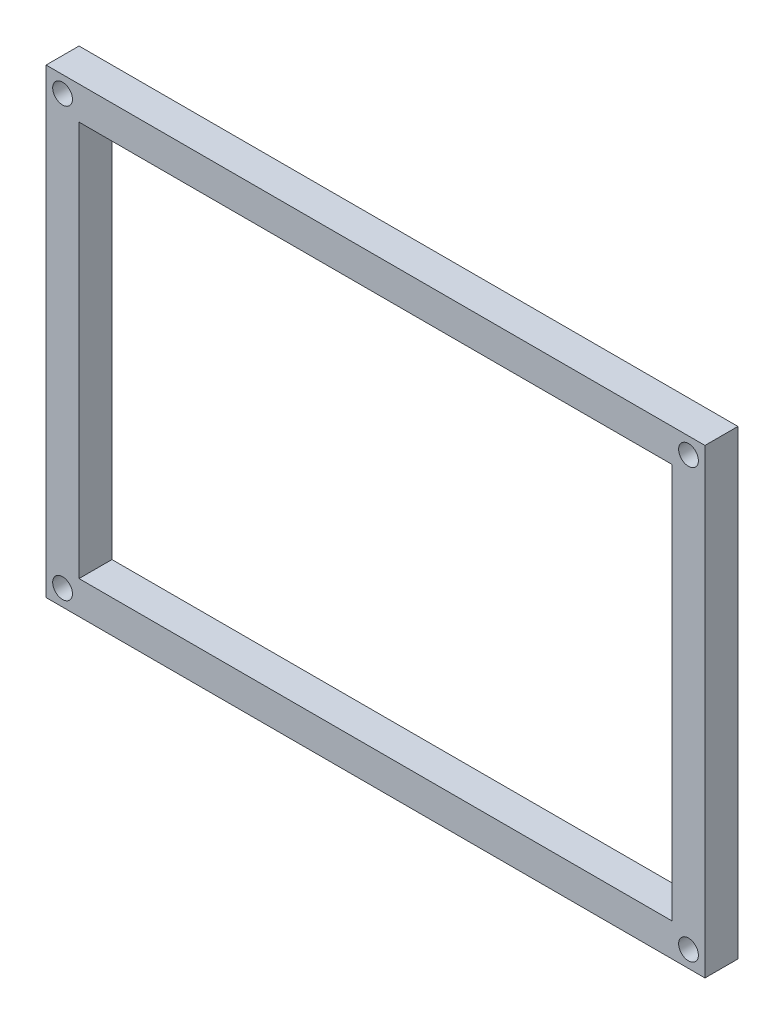
ISO-10303-21;
HEADER;
FILE_DESCRIPTION(('STEP AP214'),'2;1');
FILE_NAME('part.step','',(''),(''),'','','');
FILE_SCHEMA(('AUTOMOTIVE_DESIGN { 1 0 10303 214 1 1 1 1 }'));
ENDSEC;
DATA;
#1=APPLICATION_CONTEXT('core data for automotive mechanical design processes');
#2=APPLICATION_PROTOCOL_DEFINITION('international standard','automotive_design',2000,#1);
#3=PRODUCT_CONTEXT('',#1,'mechanical');
#4=PRODUCT('Part','Part','',(#3));
#5=PRODUCT_RELATED_PRODUCT_CATEGORY('part','',(#4));
#6=PRODUCT_DEFINITION_FORMATION('','',#4);
#7=PRODUCT_DEFINITION_CONTEXT('part definition',#1,'design');
#8=PRODUCT_DEFINITION('design','',#6,#7);
#9=PRODUCT_DEFINITION_SHAPE('','',#8);
#10=(LENGTH_UNIT() NAMED_UNIT(*) SI_UNIT(.MILLI.,.METRE.));
#11=(NAMED_UNIT(*) PLANE_ANGLE_UNIT() SI_UNIT($,.RADIAN.));
#12=(NAMED_UNIT(*) SI_UNIT($,.STERADIAN.) SOLID_ANGLE_UNIT());
#13=UNCERTAINTY_MEASURE_WITH_UNIT(LENGTH_MEASURE(1.E-05),#10,'distance_accuracy_value','');
#14=(GEOMETRIC_REPRESENTATION_CONTEXT(3) GLOBAL_UNCERTAINTY_ASSIGNED_CONTEXT((#13)) GLOBAL_UNIT_ASSIGNED_CONTEXT((#10,
#11,#12)) REPRESENTATION_CONTEXT('',''));
#15=CARTESIAN_POINT('',(0.,0.,0.));
#16=DIRECTION('',(0.,0.,1.));
#17=DIRECTION('',(1.,0.,0.));
#18=AXIS2_PLACEMENT_3D('',#15,#16,#17);
#19=CARTESIAN_POINT('',(0.,-5.,5.));
#20=DIRECTION('',(0.,1.,0.));
#21=DIRECTION('',(-1.,0.,0.));
#22=AXIS2_PLACEMENT_3D('',#19,#20,#21);
#23=PLANE('',#22);
#24=DIRECTION('',(1.,0.,0.));
#25=VECTOR('',#24,1.);
#26=CARTESIAN_POINT('',(0.,-5.,0.));
#27=LINE('',#26,#25);
#28=CARTESIAN_POINT('',(-5.,-5.,0.));
#29=VERTEX_POINT('',#28);
#30=CARTESIAN_POINT('',(95.,-4.99999999999998,0.));
#31=VERTEX_POINT('',#30);
#32=EDGE_CURVE('E153',#29,#31,#27,.T.);
#33=ORIENTED_EDGE('',*,*,#32,.T.);
#34=DIRECTION('',(0.,0.,-1.));
#35=VECTOR('',#34,1.);
#36=CARTESIAN_POINT('',(95.,-4.99999999999998,5.));
#37=LINE('',#36,#35);
#38=CARTESIAN_POINT('',(95.,-4.99999999999998,5.));
#39=VERTEX_POINT('',#38);
#40=EDGE_CURVE('E11',#39,#31,#37,.T.);
#41=ORIENTED_EDGE('',*,*,#40,.F.);
#42=DIRECTION('',(1.,0.,0.));
#43=VECTOR('',#42,1.);
#44=CARTESIAN_POINT('',(0.,-5.,5.));
#45=LINE('',#44,#43);
#46=CARTESIAN_POINT('',(-5.,-5.,5.));
#47=VERTEX_POINT('',#46);
#48=EDGE_CURVE('E112',#47,#39,#45,.T.);
#49=ORIENTED_EDGE('',*,*,#48,.F.);
#50=DIRECTION('',(0.,0.,-1.));
#51=VECTOR('',#50,1.);
#52=CARTESIAN_POINT('',(-5.,-5.,5.));
#53=LINE('',#52,#51);
#54=EDGE_CURVE('E52',#47,#29,#53,.T.);
#55=ORIENTED_EDGE('',*,*,#54,.T.);
#56=EDGE_LOOP('',(#33,#41,#49,#55));
#57=FACE_BOUND('',#56,.T.);
#58=ADVANCED_FACE('F33',(#57),#23,.F.);
#59=CARTESIAN_POINT('',(95.,0.,5.));
#60=DIRECTION('',(-1.,0.,0.));
#61=DIRECTION('',(0.,-1.,0.));
#62=AXIS2_PLACEMENT_3D('',#59,#60,#61);
#63=PLANE('',#62);
#64=DIRECTION('',(0.,1.,0.));
#65=VECTOR('',#64,1.);
#66=CARTESIAN_POINT('',(95.,0.,0.));
#67=LINE('',#66,#65);
#68=CARTESIAN_POINT('',(95.,65.,0.));
#69=VERTEX_POINT('',#68);
#70=EDGE_CURVE('E118',#31,#69,#67,.T.);
#71=ORIENTED_EDGE('',*,*,#70,.T.);
#72=DIRECTION('',(0.,0.,-1.));
#73=VECTOR('',#72,1.);
#74=CARTESIAN_POINT('',(95.,65.,5.));
#75=LINE('',#74,#73);
#76=CARTESIAN_POINT('',(95.,65.,5.));
#77=VERTEX_POINT('',#76);
#78=EDGE_CURVE('E43',#77,#69,#75,.T.);
#79=ORIENTED_EDGE('',*,*,#78,.F.);
#80=DIRECTION('',(0.,1.,0.));
#81=VECTOR('',#80,1.);
#82=CARTESIAN_POINT('',(95.,0.,5.));
#83=LINE('',#82,#81);
#84=EDGE_CURVE('E106',#39,#77,#83,.T.);
#85=ORIENTED_EDGE('',*,*,#84,.F.);
#86=ORIENTED_EDGE('',*,*,#40,.T.);
#87=EDGE_LOOP('',(#71,#79,#85,#86));
#88=FACE_BOUND('',#87,.T.);
#89=ADVANCED_FACE('F117',(#88),#63,.F.);
#90=CARTESIAN_POINT('',(0.,65.,5.));
#91=DIRECTION('',(0.,1.,0.));
#92=DIRECTION('',(-1.,0.,0.));
#93=AXIS2_PLACEMENT_3D('',#90,#91,#92);
#94=PLANE('',#93);
#95=DIRECTION('',(1.,0.,0.));
#96=VECTOR('',#95,1.);
#97=CARTESIAN_POINT('',(0.,65.,0.));
#98=LINE('',#97,#96);
#99=CARTESIAN_POINT('',(-5.,65.,0.));
#100=VERTEX_POINT('',#99);
#101=EDGE_CURVE('E156',#100,#69,#98,.T.);
#102=ORIENTED_EDGE('',*,*,#101,.F.);
#103=DIRECTION('',(0.,0.,-1.));
#104=VECTOR('',#103,1.);
#105=CARTESIAN_POINT('',(-5.,65.,5.));
#106=LINE('',#105,#104);
#107=CARTESIAN_POINT('',(-5.,65.,5.));
#108=VERTEX_POINT('',#107);
#109=EDGE_CURVE('E78',#108,#100,#106,.T.);
#110=ORIENTED_EDGE('',*,*,#109,.F.);
#111=DIRECTION('',(1.,0.,0.));
#112=VECTOR('',#111,1.);
#113=CARTESIAN_POINT('',(0.,65.,5.));
#114=LINE('',#113,#112);
#115=EDGE_CURVE('E111',#108,#77,#114,.T.);
#116=ORIENTED_EDGE('',*,*,#115,.T.);
#117=ORIENTED_EDGE('',*,*,#78,.T.);
#118=EDGE_LOOP('',(#102,#110,#116,#117));
#119=FACE_BOUND('',#118,.T.);
#120=ADVANCED_FACE('F122',(#119),#94,.T.);
#121=CARTESIAN_POINT('',(90.,0.,5.));
#122=DIRECTION('',(-1.,0.,0.));
#123=DIRECTION('',(0.,0.,1.));
#124=AXIS2_PLACEMENT_3D('',#121,#122,#123);
#125=PLANE('',#124);
#126=DIRECTION('',(0.,1.,0.));
#127=VECTOR('',#126,1.);
#128=CARTESIAN_POINT('',(90.,0.,0.));
#129=LINE('',#128,#127);
#130=CARTESIAN_POINT('',(90.,0.,0.));
#131=VERTEX_POINT('',#130);
#132=CARTESIAN_POINT('',(90.,60.,0.));
#133=VERTEX_POINT('',#132);
#134=EDGE_CURVE('E141',#131,#133,#129,.T.);
#135=ORIENTED_EDGE('',*,*,#134,.F.);
#136=DIRECTION('',(0.,0.,-1.));
#137=VECTOR('',#136,1.);
#138=CARTESIAN_POINT('',(90.,0.,5.));
#139=LINE('',#138,#137);
#140=CARTESIAN_POINT('',(90.,0.,5.));
#141=VERTEX_POINT('',#140);
#142=EDGE_CURVE('E37',#141,#131,#139,.T.);
#143=ORIENTED_EDGE('',*,*,#142,.F.);
#144=DIRECTION('',(0.,1.,0.));
#145=VECTOR('',#144,1.);
#146=CARTESIAN_POINT('',(90.,0.,5.));
#147=LINE('',#146,#145);
#148=CARTESIAN_POINT('',(90.,60.,5.));
#149=VERTEX_POINT('',#148);
#150=EDGE_CURVE('E192',#141,#149,#147,.T.);
#151=ORIENTED_EDGE('',*,*,#150,.T.);
#152=DIRECTION('',(0.,0.,-1.));
#153=VECTOR('',#152,1.);
#154=CARTESIAN_POINT('',(90.,60.,5.));
#155=LINE('',#154,#153);
#156=EDGE_CURVE('E125',#149,#133,#155,.T.);
#157=ORIENTED_EDGE('',*,*,#156,.T.);
#158=EDGE_LOOP('',(#135,#143,#151,#157));
#159=FACE_BOUND('',#158,.T.);
#160=ADVANCED_FACE('F177',(#159),#125,.T.);
#161=CARTESIAN_POINT('',(0.,0.,5.));
#162=DIRECTION('',(0.,1.,0.));
#163=DIRECTION('',(0.,0.,1.));
#164=AXIS2_PLACEMENT_3D('',#161,#162,#163);
#165=PLANE('',#164);
#166=DIRECTION('',(1.,0.,0.));
#167=VECTOR('',#166,1.);
#168=CARTESIAN_POINT('',(0.,0.,0.));
#169=LINE('',#168,#167);
#170=CARTESIAN_POINT('',(0.,0.,0.));
#171=VERTEX_POINT('',#170);
#172=EDGE_CURVE('E144',#171,#131,#169,.T.);
#173=ORIENTED_EDGE('',*,*,#172,.F.);
#174=DIRECTION('',(0.,0.,-1.));
#175=VECTOR('',#174,1.);
#176=CARTESIAN_POINT('',(0.,0.,5.));
#177=LINE('',#176,#175);
#178=CARTESIAN_POINT('',(0.,0.,5.));
#179=VERTEX_POINT('',#178);
#180=EDGE_CURVE('E167',#179,#171,#177,.T.);
#181=ORIENTED_EDGE('',*,*,#180,.F.);
#182=DIRECTION('',(1.,0.,0.));
#183=VECTOR('',#182,1.);
#184=CARTESIAN_POINT('',(0.,0.,5.));
#185=LINE('',#184,#183);
#186=EDGE_CURVE('E176',#179,#141,#185,.T.);
#187=ORIENTED_EDGE('',*,*,#186,.T.);
#188=ORIENTED_EDGE('',*,*,#142,.T.);
#189=EDGE_LOOP('',(#173,#181,#187,#188));
#190=FACE_BOUND('',#189,.T.);
#191=ADVANCED_FACE('F174',(#190),#165,.T.);
#192=CARTESIAN_POINT('',(0.,0.,5.));
#193=DIRECTION('',(-1.,0.,0.));
#194=DIRECTION('',(0.,0.,1.));
#195=AXIS2_PLACEMENT_3D('',#192,#193,#194);
#196=PLANE('',#195);
#197=DIRECTION('',(0.,1.,0.));
#198=VECTOR('',#197,1.);
#199=CARTESIAN_POINT('',(0.,0.,0.));
#200=LINE('',#199,#198);
#201=CARTESIAN_POINT('',(0.,60.,0.));
#202=VERTEX_POINT('',#201);
#203=EDGE_CURVE('E147',#171,#202,#200,.T.);
#204=ORIENTED_EDGE('',*,*,#203,.T.);
#205=DIRECTION('',(0.,0.,-1.));
#206=VECTOR('',#205,1.);
#207=CARTESIAN_POINT('',(0.,60.,5.));
#208=LINE('',#207,#206);
#209=CARTESIAN_POINT('',(0.,60.,5.));
#210=VERTEX_POINT('',#209);
#211=EDGE_CURVE('E165',#210,#202,#208,.T.);
#212=ORIENTED_EDGE('',*,*,#211,.F.);
#213=DIRECTION('',(0.,1.,0.));
#214=VECTOR('',#213,1.);
#215=CARTESIAN_POINT('',(0.,0.,5.));
#216=LINE('',#215,#214);
#217=EDGE_CURVE('E185',#179,#210,#216,.T.);
#218=ORIENTED_EDGE('',*,*,#217,.F.);
#219=ORIENTED_EDGE('',*,*,#180,.T.);
#220=EDGE_LOOP('',(#204,#212,#218,#219));
#221=FACE_BOUND('',#220,.T.);
#222=ADVANCED_FACE('F183',(#221),#196,.F.);
#223=CARTESIAN_POINT('',(0.,60.,5.));
#224=DIRECTION('',(0.,1.,0.));
#225=DIRECTION('',(0.,0.,1.));
#226=AXIS2_PLACEMENT_3D('',#223,#224,#225);
#227=PLANE('',#226);
#228=DIRECTION('',(1.,0.,0.));
#229=VECTOR('',#228,1.);
#230=CARTESIAN_POINT('',(0.,60.,0.));
#231=LINE('',#230,#229);
#232=EDGE_CURVE('E150',#202,#133,#231,.T.);
#233=ORIENTED_EDGE('',*,*,#232,.T.);
#234=ORIENTED_EDGE('',*,*,#156,.F.);
#235=DIRECTION('',(1.,0.,0.));
#236=VECTOR('',#235,1.);
#237=CARTESIAN_POINT('',(0.,60.,5.));
#238=LINE('',#237,#236);
#239=EDGE_CURVE('E188',#210,#149,#238,.T.);
#240=ORIENTED_EDGE('',*,*,#239,.F.);
#241=ORIENTED_EDGE('',*,*,#211,.T.);
#242=EDGE_LOOP('',(#233,#234,#240,#241));
#243=FACE_BOUND('',#242,.T.);
#244=ADVANCED_FACE('F187',(#243),#227,.F.);
#245=CARTESIAN_POINT('',(-2.5,-2.5,5.));
#246=DIRECTION('',(0.,0.,-1.));
#247=DIRECTION('',(-1.,0.,0.));
#248=AXIS2_PLACEMENT_3D('',#245,#246,#247);
#249=CYLINDRICAL_SURFACE('',#248,1.5);
#250=CARTESIAN_POINT('',(-2.5,-2.5,5.));
#251=DIRECTION('',(0.,0.,1.));
#252=DIRECTION('',(1.,0.,0.));
#253=AXIS2_PLACEMENT_3D('',#250,#251,#252);
#254=CIRCLE('',#253,1.5);
#255=CARTESIAN_POINT('',(-1.,-2.5,5.));
#256=VERTEX_POINT('',#255);
#257=EDGE_CURVE('E196',#256,#256,#254,.T.);
#258=ORIENTED_EDGE('',*,*,#257,.T.);
#259=EDGE_LOOP('',(#258));
#260=FACE_BOUND('',#259,.T.);
#261=CARTESIAN_POINT('',(-2.5,-2.5,0.));
#262=DIRECTION('',(0.,0.,1.));
#263=DIRECTION('',(1.,0.,0.));
#264=AXIS2_PLACEMENT_3D('',#261,#262,#263);
#265=CIRCLE('',#264,1.5);
#266=CARTESIAN_POINT('',(-1.,-2.5,0.));
#267=VERTEX_POINT('',#266);
#268=EDGE_CURVE('E138',#267,#267,#265,.T.);
#269=ORIENTED_EDGE('',*,*,#268,.F.);
#270=EDGE_LOOP('',(#269));
#271=FACE_BOUND('',#270,.T.);
#272=ADVANCED_FACE('F220',(#260,#271),#249,.F.);
#273=CARTESIAN_POINT('',(-2.50000000000002,62.5,5.));
#274=DIRECTION('',(0.,0.,-1.));
#275=DIRECTION('',(-1.,0.,0.));
#276=AXIS2_PLACEMENT_3D('',#273,#274,#275);
#277=CYLINDRICAL_SURFACE('',#276,1.5);
#278=CARTESIAN_POINT('',(-2.50000000000002,62.5,5.));
#279=DIRECTION('',(0.,0.,1.));
#280=DIRECTION('',(1.,0.,0.));
#281=AXIS2_PLACEMENT_3D('',#278,#279,#280);
#282=CIRCLE('',#281,1.5);
#283=CARTESIAN_POINT('',(-1.00000000000002,62.5,5.));
#284=VERTEX_POINT('',#283);
#285=EDGE_CURVE('E199',#284,#284,#282,.T.);
#286=ORIENTED_EDGE('',*,*,#285,.T.);
#287=EDGE_LOOP('',(#286));
#288=FACE_BOUND('',#287,.T.);
#289=CARTESIAN_POINT('',(-2.50000000000002,62.5,0.));
#290=DIRECTION('',(0.,0.,1.));
#291=DIRECTION('',(1.,0.,0.));
#292=AXIS2_PLACEMENT_3D('',#289,#290,#291);
#293=CIRCLE('',#292,1.5);
#294=CARTESIAN_POINT('',(-1.00000000000002,62.5,0.));
#295=VERTEX_POINT('',#294);
#296=EDGE_CURVE('E135',#295,#295,#293,.T.);
#297=ORIENTED_EDGE('',*,*,#296,.F.);
#298=EDGE_LOOP('',(#297));
#299=FACE_BOUND('',#298,.T.);
#300=ADVANCED_FACE('F223',(#288,#299),#277,.F.);
#301=CARTESIAN_POINT('',(92.5,62.5,5.));
#302=DIRECTION('',(0.,0.,-1.));
#303=DIRECTION('',(-1.,0.,0.));
#304=AXIS2_PLACEMENT_3D('',#301,#302,#303);
#305=CYLINDRICAL_SURFACE('',#304,1.5);
#306=CARTESIAN_POINT('',(92.5,62.5,5.));
#307=DIRECTION('',(0.,0.,1.));
#308=DIRECTION('',(1.,0.,0.));
#309=AXIS2_PLACEMENT_3D('',#306,#307,#308);
#310=CIRCLE('',#309,1.5);
#311=CARTESIAN_POINT('',(94.,62.5,5.));
#312=VERTEX_POINT('',#311);
#313=EDGE_CURVE('E202',#312,#312,#310,.T.);
#314=ORIENTED_EDGE('',*,*,#313,.T.);
#315=EDGE_LOOP('',(#314));
#316=FACE_BOUND('',#315,.T.);
#317=CARTESIAN_POINT('',(92.5,62.5,0.));
#318=DIRECTION('',(0.,0.,1.));
#319=DIRECTION('',(1.,0.,0.));
#320=AXIS2_PLACEMENT_3D('',#317,#318,#319);
#321=CIRCLE('',#320,1.5);
#322=CARTESIAN_POINT('',(94.,62.5,0.));
#323=VERTEX_POINT('',#322);
#324=EDGE_CURVE('E132',#323,#323,#321,.T.);
#325=ORIENTED_EDGE('',*,*,#324,.F.);
#326=EDGE_LOOP('',(#325));
#327=FACE_BOUND('',#326,.T.);
#328=ADVANCED_FACE('F251',(#316,#327),#305,.F.);
#329=CARTESIAN_POINT('',(92.5,-2.49999999999998,5.));
#330=DIRECTION('',(0.,0.,-1.));
#331=DIRECTION('',(-1.,0.,0.));
#332=AXIS2_PLACEMENT_3D('',#329,#330,#331);
#333=CYLINDRICAL_SURFACE('',#332,1.5);
#334=CARTESIAN_POINT('',(92.5,-2.49999999999998,5.));
#335=DIRECTION('',(0.,0.,1.));
#336=DIRECTION('',(1.,0.,0.));
#337=AXIS2_PLACEMENT_3D('',#334,#335,#336);
#338=CIRCLE('',#337,1.5);
#339=CARTESIAN_POINT('',(94.,-2.49999999999998,5.));
#340=VERTEX_POINT('',#339);
#341=EDGE_CURVE('E161',#340,#340,#338,.T.);
#342=ORIENTED_EDGE('',*,*,#341,.T.);
#343=EDGE_LOOP('',(#342));
#344=FACE_BOUND('',#343,.T.);
#345=CARTESIAN_POINT('',(92.5,-2.49999999999998,0.));
#346=DIRECTION('',(0.,0.,1.));
#347=DIRECTION('',(1.,0.,0.));
#348=AXIS2_PLACEMENT_3D('',#345,#346,#347);
#349=CIRCLE('',#348,1.5);
#350=CARTESIAN_POINT('',(94.,-2.49999999999998,0.));
#351=VERTEX_POINT('',#350);
#352=EDGE_CURVE('E129',#351,#351,#349,.T.);
#353=ORIENTED_EDGE('',*,*,#352,.F.);
#354=EDGE_LOOP('',(#353));
#355=FACE_BOUND('',#354,.T.);
#356=ADVANCED_FACE('F35',(#344,#355),#333,.F.);
#357=CARTESIAN_POINT('',(-5.,0.,5.));
#358=DIRECTION('',(-1.,0.,0.));
#359=DIRECTION('',(0.,-1.,0.));
#360=AXIS2_PLACEMENT_3D('',#357,#358,#359);
#361=PLANE('',#360);
#362=DIRECTION('',(0.,1.,0.));
#363=VECTOR('',#362,1.);
#364=CARTESIAN_POINT('',(-5.,0.,0.));
#365=LINE('',#364,#363);
#366=EDGE_CURVE('E158',#29,#100,#365,.T.);
#367=ORIENTED_EDGE('',*,*,#366,.F.);
#368=ORIENTED_EDGE('',*,*,#54,.F.);
#369=DIRECTION('',(0.,1.,0.));
#370=VECTOR('',#369,1.);
#371=CARTESIAN_POINT('',(-5.,0.,5.));
#372=LINE('',#371,#370);
#373=EDGE_CURVE('E123',#47,#108,#372,.T.);
#374=ORIENTED_EDGE('',*,*,#373,.T.);
#375=ORIENTED_EDGE('',*,*,#109,.T.);
#376=EDGE_LOOP('',(#367,#368,#374,#375));
#377=FACE_BOUND('',#376,.T.);
#378=ADVANCED_FACE('F212',(#377),#361,.T.);
#379=CARTESIAN_POINT('',(0.,0.,5.));
#380=DIRECTION('',(0.,0.,1.));
#381=DIRECTION('',(1.,0.,0.));
#382=AXIS2_PLACEMENT_3D('',#379,#380,#381);
#383=PLANE('',#382);
#384=ORIENTED_EDGE('',*,*,#341,.F.);
#385=EDGE_LOOP('',(#384));
#386=FACE_BOUND('',#385,.T.);
#387=ORIENTED_EDGE('',*,*,#313,.F.);
#388=EDGE_LOOP('',(#387));
#389=FACE_BOUND('',#388,.T.);
#390=ORIENTED_EDGE('',*,*,#285,.F.);
#391=EDGE_LOOP('',(#390));
#392=FACE_BOUND('',#391,.T.);
#393=ORIENTED_EDGE('',*,*,#257,.F.);
#394=EDGE_LOOP('',(#393));
#395=FACE_BOUND('',#394,.T.);
#396=ORIENTED_EDGE('',*,*,#150,.F.);
#397=ORIENTED_EDGE('',*,*,#186,.F.);
#398=ORIENTED_EDGE('',*,*,#217,.T.);
#399=ORIENTED_EDGE('',*,*,#239,.T.);
#400=EDGE_LOOP('',(#396,#397,#398,#399));
#401=FACE_BOUND('',#400,.T.);
#402=ORIENTED_EDGE('',*,*,#48,.T.);
#403=ORIENTED_EDGE('',*,*,#84,.T.);
#404=ORIENTED_EDGE('',*,*,#115,.F.);
#405=ORIENTED_EDGE('',*,*,#373,.F.);
#406=EDGE_LOOP('',(#402,#403,#404,#405));
#407=FACE_BOUND('',#406,.T.);
#408=ADVANCED_FACE('F108',(#386,#389,#392,#395,#401,#407),#383,.T.);
#409=CARTESIAN_POINT('',(0.,0.,0.));
#410=DIRECTION('',(0.,0.,1.));
#411=DIRECTION('',(1.,0.,0.));
#412=AXIS2_PLACEMENT_3D('',#409,#410,#411);
#413=PLANE('',#412);
#414=ORIENTED_EDGE('',*,*,#352,.T.);
#415=EDGE_LOOP('',(#414));
#416=FACE_BOUND('',#415,.T.);
#417=ORIENTED_EDGE('',*,*,#324,.T.);
#418=EDGE_LOOP('',(#417));
#419=FACE_BOUND('',#418,.T.);
#420=ORIENTED_EDGE('',*,*,#296,.T.);
#421=EDGE_LOOP('',(#420));
#422=FACE_BOUND('',#421,.T.);
#423=ORIENTED_EDGE('',*,*,#268,.T.);
#424=EDGE_LOOP('',(#423));
#425=FACE_BOUND('',#424,.T.);
#426=ORIENTED_EDGE('',*,*,#134,.T.);
#427=ORIENTED_EDGE('',*,*,#232,.F.);
#428=ORIENTED_EDGE('',*,*,#203,.F.);
#429=ORIENTED_EDGE('',*,*,#172,.T.);
#430=EDGE_LOOP('',(#426,#427,#428,#429));
#431=FACE_BOUND('',#430,.T.);
#432=ORIENTED_EDGE('',*,*,#32,.F.);
#433=ORIENTED_EDGE('',*,*,#366,.T.);
#434=ORIENTED_EDGE('',*,*,#101,.T.);
#435=ORIENTED_EDGE('',*,*,#70,.F.);
#436=EDGE_LOOP('',(#432,#433,#434,#435));
#437=FACE_BOUND('',#436,.T.);
#438=ADVANCED_FACE('F180',(#416,#419,#422,#425,#431,#437),#413,.F.);
#439=CLOSED_SHELL('',(#58,#89,#120,#160,#191,#222,#244,#272,#300,#328,#356,#378,#408,#438));
#440=MANIFOLD_SOLID_BREP('B2',#439);
#441=ADVANCED_BREP_SHAPE_REPRESENTATION('',(#18,#440),#14);
#442=SHAPE_DEFINITION_REPRESENTATION(#9,#441);
ENDSEC;
END-ISO-10303-21;
